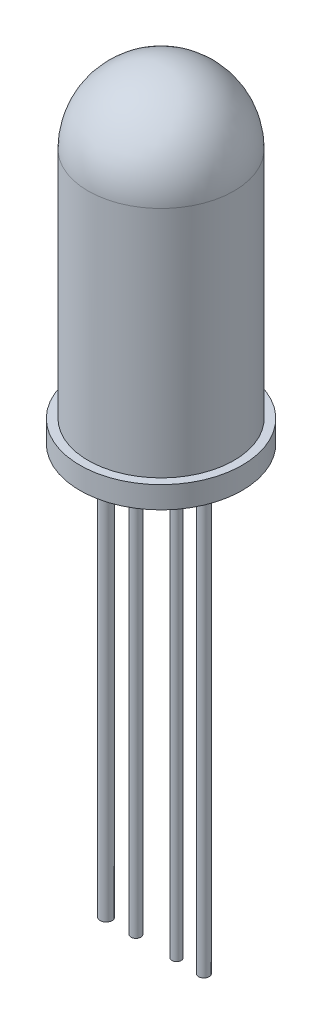
ISO-10303-21;
HEADER;
FILE_DESCRIPTION(('STEP AP214'),'2;1');
FILE_NAME('part.step','',(''),(''),'','','');
FILE_SCHEMA(('AUTOMOTIVE_DESIGN { 1 0 10303 214 1 1 1 1 }'));
ENDSEC;
DATA;
#1=APPLICATION_CONTEXT('core data for automotive mechanical design processes');
#2=APPLICATION_PROTOCOL_DEFINITION('international standard','automotive_design',2000,#1);
#3=PRODUCT_CONTEXT('',#1,'mechanical');
#4=PRODUCT('Part','Part','',(#3));
#5=PRODUCT_RELATED_PRODUCT_CATEGORY('part','',(#4));
#6=PRODUCT_DEFINITION_FORMATION('','',#4);
#7=PRODUCT_DEFINITION_CONTEXT('part definition',#1,'design');
#8=PRODUCT_DEFINITION('design','',#6,#7);
#9=PRODUCT_DEFINITION_SHAPE('','',#8);
#10=(LENGTH_UNIT() NAMED_UNIT(*) SI_UNIT(.MILLI.,.METRE.));
#11=(NAMED_UNIT(*) PLANE_ANGLE_UNIT() SI_UNIT($,.RADIAN.));
#12=(NAMED_UNIT(*) SI_UNIT($,.STERADIAN.) SOLID_ANGLE_UNIT());
#13=UNCERTAINTY_MEASURE_WITH_UNIT(LENGTH_MEASURE(1.E-05),#10,'distance_accuracy_value','');
#14=(GEOMETRIC_REPRESENTATION_CONTEXT(3) GLOBAL_UNCERTAINTY_ASSIGNED_CONTEXT((#13)) GLOBAL_UNIT_ASSIGNED_CONTEXT((#10,
#11,#12)) REPRESENTATION_CONTEXT('',''));
#15=CARTESIAN_POINT('',(0.,0.,0.));
#16=DIRECTION('',(0.,0.,1.));
#17=DIRECTION('',(1.,0.,0.));
#18=AXIS2_PLACEMENT_3D('',#15,#16,#17);
#19=CARTESIAN_POINT('',(1.17503083359897,-12.,0.));
#20=DIRECTION('',(0.,1.,0.));
#21=DIRECTION('',(0.,0.,1.));
#22=AXIS2_PLACEMENT_3D('',#19,#20,#21);
#23=CYLINDRICAL_SURFACE('',#22,0.147647853436519);
#24=CARTESIAN_POINT('',(1.17503083359897,-12.,0.));
#25=DIRECTION('',(0.,-1.,0.));
#26=DIRECTION('',(0.,0.,-1.));
#27=AXIS2_PLACEMENT_3D('',#24,#25,#26);
#28=CIRCLE('',#27,0.147647853436519);
#29=CARTESIAN_POINT('',(1.17503083359897,-12.,-0.147647853436519));
#30=VERTEX_POINT('',#29);
#31=EDGE_CURVE('E11',#30,#30,#28,.T.);
#32=ORIENTED_EDGE('',*,*,#31,.F.);
#33=EDGE_LOOP('',(#32));
#34=FACE_BOUND('',#33,.T.);
#35=CARTESIAN_POINT('',(1.17503083359897,0.,0.));
#36=DIRECTION('',(0.,-1.,0.));
#37=DIRECTION('',(0.,0.,-1.));
#38=AXIS2_PLACEMENT_3D('',#35,#36,#37);
#39=CIRCLE('',#38,0.147647853436519);
#40=CARTESIAN_POINT('',(1.17503083359897,0.,-0.147647853436519));
#41=VERTEX_POINT('',#40);
#42=EDGE_CURVE('E44',#41,#41,#39,.T.);
#43=ORIENTED_EDGE('',*,*,#42,.T.);
#44=EDGE_LOOP('',(#43));
#45=FACE_BOUND('',#44,.T.);
#46=ADVANCED_FACE('F41',(#34,#45),#23,.T.);
#47=CARTESIAN_POINT('',(1.17503083359897,-12.,0.));
#48=DIRECTION('',(0.,-1.,0.));
#49=DIRECTION('',(0.,0.,-1.));
#50=AXIS2_PLACEMENT_3D('',#47,#48,#49);
#51=PLANE('',#50);
#52=ORIENTED_EDGE('',*,*,#31,.T.);
#53=EDGE_LOOP('',(#52));
#54=FACE_BOUND('',#53,.T.);
#55=ADVANCED_FACE('F56',(#54),#51,.T.);
#56=CARTESIAN_POINT('',(1.17503083359897,0.,0.));
#57=DIRECTION('',(0.,-1.,0.));
#58=DIRECTION('',(0.,0.,-1.));
#59=AXIS2_PLACEMENT_3D('',#56,#57,#58);
#60=PLANE('',#59);
#61=ORIENTED_EDGE('',*,*,#42,.F.);
#62=EDGE_LOOP('',(#61));
#63=FACE_BOUND('',#62,.T.);
#64=ADVANCED_FACE('F54',(#63),#60,.F.);
#65=CLOSED_SHELL('',(#46,#55,#64));
#66=MANIFOLD_SOLID_BREP('B2',#65);
#67=CARTESIAN_POINT('',(0.424487578629994,-12.,0.));
#68=DIRECTION('',(0.,1.,0.));
#69=DIRECTION('',(0.,0.,1.));
#70=AXIS2_PLACEMENT_3D('',#67,#68,#69);
#71=CYLINDRICAL_SURFACE('',#70,0.129191871756955);
#72=CARTESIAN_POINT('',(0.424487578629994,-12.,0.));
#73=DIRECTION('',(0.,-1.,0.));
#74=DIRECTION('',(0.,0.,-1.));
#75=AXIS2_PLACEMENT_3D('',#72,#73,#74);
#76=CIRCLE('',#75,0.129191871756955);
#77=CARTESIAN_POINT('',(0.424487578629994,-12.,-0.129191871756955));
#78=VERTEX_POINT('',#77);
#79=EDGE_CURVE('E40',#78,#78,#76,.T.);
#80=ORIENTED_EDGE('',*,*,#79,.F.);
#81=EDGE_LOOP('',(#80));
#82=FACE_BOUND('',#81,.T.);
#83=CARTESIAN_POINT('',(0.424487578629994,0.,0.));
#84=DIRECTION('',(0.,-1.,0.));
#85=DIRECTION('',(0.,0.,-1.));
#86=AXIS2_PLACEMENT_3D('',#83,#84,#85);
#87=CIRCLE('',#86,0.129191871756955);
#88=CARTESIAN_POINT('',(0.424487578629994,0.,-0.129191871756955));
#89=VERTEX_POINT('',#88);
#90=EDGE_CURVE('E92',#89,#89,#87,.T.);
#91=ORIENTED_EDGE('',*,*,#90,.T.);
#92=EDGE_LOOP('',(#91));
#93=FACE_BOUND('',#92,.T.);
#94=ADVANCED_FACE('F89',(#82,#93),#71,.T.);
#95=CARTESIAN_POINT('',(0.424487578629994,-12.,0.));
#96=DIRECTION('',(0.,-1.,0.));
#97=DIRECTION('',(0.,0.,-1.));
#98=AXIS2_PLACEMENT_3D('',#95,#96,#97);
#99=PLANE('',#98);
#100=ORIENTED_EDGE('',*,*,#79,.T.);
#101=EDGE_LOOP('',(#100));
#102=FACE_BOUND('',#101,.T.);
#103=ADVANCED_FACE('F104',(#102),#99,.T.);
#104=CARTESIAN_POINT('',(0.424487578629994,0.,0.));
#105=DIRECTION('',(0.,-1.,0.));
#106=DIRECTION('',(0.,0.,-1.));
#107=AXIS2_PLACEMENT_3D('',#104,#105,#106);
#108=PLANE('',#107);
#109=ORIENTED_EDGE('',*,*,#90,.F.);
#110=EDGE_LOOP('',(#109));
#111=FACE_BOUND('',#110,.T.);
#112=ADVANCED_FACE('F102',(#111),#108,.F.);
#113=CLOSED_SHELL('',(#94,#103,#112));
#114=MANIFOLD_SOLID_BREP('B6',#113);
#115=CARTESIAN_POINT('',(-1.50723850383114,-12.,0.));
#116=DIRECTION('',(0.,1.,0.));
#117=DIRECTION('',(0.,0.,1.));
#118=AXIS2_PLACEMENT_3D('',#115,#116,#117);
#119=CYLINDRICAL_SURFACE('',#118,0.166103835116085);
#120=CARTESIAN_POINT('',(-1.50723850383114,-12.,0.));
#121=DIRECTION('',(0.,-1.,0.));
#122=DIRECTION('',(0.,0.,-1.));
#123=AXIS2_PLACEMENT_3D('',#120,#121,#122);
#124=CIRCLE('',#123,0.166103835116085);
#125=CARTESIAN_POINT('',(-1.50723850383114,-12.,-0.166103835116085));
#126=VERTEX_POINT('',#125);
#127=EDGE_CURVE('E88',#126,#126,#124,.T.);
#128=ORIENTED_EDGE('',*,*,#127,.F.);
#129=EDGE_LOOP('',(#128));
#130=FACE_BOUND('',#129,.T.);
#131=CARTESIAN_POINT('',(-1.50723850383114,0.,0.));
#132=DIRECTION('',(0.,-1.,0.));
#133=DIRECTION('',(0.,0.,-1.));
#134=AXIS2_PLACEMENT_3D('',#131,#132,#133);
#135=CIRCLE('',#134,0.166103835116085);
#136=CARTESIAN_POINT('',(-1.50723850383114,0.,-0.166103835116085));
#137=VERTEX_POINT('',#136);
#138=EDGE_CURVE('E140',#137,#137,#135,.T.);
#139=ORIENTED_EDGE('',*,*,#138,.T.);
#140=EDGE_LOOP('',(#139));
#141=FACE_BOUND('',#140,.T.);
#142=ADVANCED_FACE('F137',(#130,#141),#119,.T.);
#143=CARTESIAN_POINT('',(-1.50723850383114,-12.,0.));
#144=DIRECTION('',(0.,-1.,0.));
#145=DIRECTION('',(0.,0.,-1.));
#146=AXIS2_PLACEMENT_3D('',#143,#144,#145);
#147=PLANE('',#146);
#148=ORIENTED_EDGE('',*,*,#127,.T.);
#149=EDGE_LOOP('',(#148));
#150=FACE_BOUND('',#149,.T.);
#151=ADVANCED_FACE('F152',(#150),#147,.T.);
#152=CARTESIAN_POINT('',(-1.50723850383114,0.,0.));
#153=DIRECTION('',(0.,-1.,0.));
#154=DIRECTION('',(0.,0.,-1.));
#155=AXIS2_PLACEMENT_3D('',#152,#153,#154);
#156=PLANE('',#155);
#157=ORIENTED_EDGE('',*,*,#138,.F.);
#158=EDGE_LOOP('',(#157));
#159=FACE_BOUND('',#158,.T.);
#160=ADVANCED_FACE('F150',(#159),#156,.F.);
#161=CLOSED_SHELL('',(#142,#151,#160));
#162=MANIFOLD_SOLID_BREP('B35',#161);
#163=CARTESIAN_POINT('',(-0.689023316037091,-12.,0.));
#164=DIRECTION('',(0.,1.,0.));
#165=DIRECTION('',(0.,0.,1.));
#166=AXIS2_PLACEMENT_3D('',#163,#164,#165);
#167=CYLINDRICAL_SURFACE('',#166,0.135343865650143);
#168=CARTESIAN_POINT('',(-0.689023316037091,-12.,0.));
#169=DIRECTION('',(0.,-1.,0.));
#170=DIRECTION('',(0.,0.,-1.));
#171=AXIS2_PLACEMENT_3D('',#168,#169,#170);
#172=CIRCLE('',#171,0.135343865650143);
#173=CARTESIAN_POINT('',(-0.689023316037091,-12.,-0.135343865650143));
#174=VERTEX_POINT('',#173);
#175=EDGE_CURVE('E136',#174,#174,#172,.T.);
#176=ORIENTED_EDGE('',*,*,#175,.F.);
#177=EDGE_LOOP('',(#176));
#178=FACE_BOUND('',#177,.T.);
#179=CARTESIAN_POINT('',(-0.689023316037091,0.,0.));
#180=DIRECTION('',(0.,-1.,0.));
#181=DIRECTION('',(0.,0.,-1.));
#182=AXIS2_PLACEMENT_3D('',#179,#180,#181);
#183=CIRCLE('',#182,0.135343865650143);
#184=CARTESIAN_POINT('',(-0.689023316037091,0.,-0.135343865650143));
#185=VERTEX_POINT('',#184);
#186=EDGE_CURVE('E187',#185,#185,#183,.T.);
#187=ORIENTED_EDGE('',*,*,#186,.T.);
#188=EDGE_LOOP('',(#187));
#189=FACE_BOUND('',#188,.T.);
#190=ADVANCED_FACE('F184',(#178,#189),#167,.T.);
#191=CARTESIAN_POINT('',(-0.689023316037091,-12.,0.));
#192=DIRECTION('',(0.,-1.,0.));
#193=DIRECTION('',(0.,0.,-1.));
#194=AXIS2_PLACEMENT_3D('',#191,#192,#193);
#195=PLANE('',#194);
#196=ORIENTED_EDGE('',*,*,#175,.T.);
#197=EDGE_LOOP('',(#196));
#198=FACE_BOUND('',#197,.T.);
#199=ADVANCED_FACE('F199',(#198),#195,.T.);
#200=CARTESIAN_POINT('',(-0.689023316037091,0.,0.));
#201=DIRECTION('',(0.,-1.,0.));
#202=DIRECTION('',(0.,0.,-1.));
#203=AXIS2_PLACEMENT_3D('',#200,#201,#202);
#204=PLANE('',#203);
#205=ORIENTED_EDGE('',*,*,#186,.F.);
#206=EDGE_LOOP('',(#205));
#207=FACE_BOUND('',#206,.T.);
#208=ADVANCED_FACE('F197',(#207),#204,.F.);
#209=CLOSED_SHELL('',(#190,#199,#208));
#210=MANIFOLD_SOLID_BREP('B83',#209);
#211=CARTESIAN_POINT('',(0.,9.,0.));
#212=DIRECTION('',(0.,-1.,0.));
#213=DIRECTION('',(0.,0.,-1.));
#214=AXIS2_PLACEMENT_3D('',#211,#212,#213);
#215=CYLINDRICAL_SURFACE('',#214,2.);
#216=CARTESIAN_POINT('',(0.,7.,0.));
#217=DIRECTION('',(0.,-1.,0.));
#218=DIRECTION('',(0.,0.,-1.));
#219=AXIS2_PLACEMENT_3D('',#216,#217,#218);
#220=CIRCLE('',#219,2.);
#221=CARTESIAN_POINT('',(0.,7.,-2.));
#222=VERTEX_POINT('',#221);
#223=EDGE_CURVE('E231',#222,#222,#220,.T.);
#224=ORIENTED_EDGE('',*,*,#223,.T.);
#225=EDGE_LOOP('',(#224));
#226=FACE_BOUND('',#225,.T.);
#227=CARTESIAN_POINT('',(0.,0.6,0.));
#228=DIRECTION('',(0.,-1.,0.));
#229=DIRECTION('',(0.,0.,-1.));
#230=AXIS2_PLACEMENT_3D('',#227,#228,#229);
#231=CIRCLE('',#230,2.);
#232=CARTESIAN_POINT('',(0.,0.6,-2.));
#233=VERTEX_POINT('',#232);
#234=EDGE_CURVE('E183',#233,#233,#231,.T.);
#235=ORIENTED_EDGE('',*,*,#234,.F.);
#236=EDGE_LOOP('',(#235));
#237=FACE_BOUND('',#236,.T.);
#238=ADVANCED_FACE('F224',(#226,#237),#215,.T.);
#239=CARTESIAN_POINT('',(0.,7.,0.));
#240=DIRECTION('',(0.,1.,0.));
#241=DIRECTION('',(0.,0.,1.));
#242=AXIS2_PLACEMENT_3D('',#239,#240,#241);
#243=SPHERICAL_SURFACE('',#242,2.);
#244=ORIENTED_EDGE('',*,*,#223,.F.);
#245=EDGE_LOOP('',(#244));
#246=FACE_BOUND('',#245,.T.);
#247=ADVANCED_FACE('F226',(#246),#243,.T.);
#248=CARTESIAN_POINT('',(0.,0.6,0.));
#249=DIRECTION('',(0.,-1.,0.));
#250=DIRECTION('',(0.,0.,-1.));
#251=AXIS2_PLACEMENT_3D('',#248,#249,#250);
#252=CYLINDRICAL_SURFACE('',#251,2.22598604348731);
#253=CARTESIAN_POINT('',(0.,0.6,0.));
#254=DIRECTION('',(0.,-1.,0.));
#255=DIRECTION('',(0.,0.,-1.));
#256=AXIS2_PLACEMENT_3D('',#253,#254,#255);
#257=CIRCLE('',#256,2.22598604348731);
#258=CARTESIAN_POINT('',(0.,0.6,-2.22598604348731));
#259=VERTEX_POINT('',#258);
#260=EDGE_CURVE('E235',#259,#259,#257,.T.);
#261=ORIENTED_EDGE('',*,*,#260,.T.);
#262=EDGE_LOOP('',(#261));
#263=FACE_BOUND('',#262,.T.);
#264=CARTESIAN_POINT('',(0.,0.,0.));
#265=DIRECTION('',(0.,-1.,0.));
#266=DIRECTION('',(0.,0.,-1.));
#267=AXIS2_PLACEMENT_3D('',#264,#265,#266);
#268=CIRCLE('',#267,2.22598604348731);
#269=CARTESIAN_POINT('',(0.,0.,-2.22598604348731));
#270=VERTEX_POINT('',#269);
#271=EDGE_CURVE('E239',#270,#270,#268,.T.);
#272=ORIENTED_EDGE('',*,*,#271,.F.);
#273=EDGE_LOOP('',(#272));
#274=FACE_BOUND('',#273,.T.);
#275=ADVANCED_FACE('F247',(#263,#274),#252,.T.);
#276=CARTESIAN_POINT('',(0.,0.6,0.));
#277=DIRECTION('',(0.,-1.,0.));
#278=DIRECTION('',(0.,0.,-1.));
#279=AXIS2_PLACEMENT_3D('',#276,#277,#278);
#280=PLANE('',#279);
#281=ORIENTED_EDGE('',*,*,#234,.T.);
#282=EDGE_LOOP('',(#281));
#283=FACE_BOUND('',#282,.T.);
#284=ORIENTED_EDGE('',*,*,#260,.F.);
#285=EDGE_LOOP('',(#284));
#286=FACE_BOUND('',#285,.T.);
#287=ADVANCED_FACE('F249',(#283,#286),#280,.F.);
#288=CARTESIAN_POINT('',(0.,0.,0.));
#289=DIRECTION('',(0.,1.,0.));
#290=DIRECTION('',(0.,0.,1.));
#291=AXIS2_PLACEMENT_3D('',#288,#289,#290);
#292=PLANE('',#291);
#293=ORIENTED_EDGE('',*,*,#271,.T.);
#294=EDGE_LOOP('',(#293));
#295=FACE_BOUND('',#294,.T.);
#296=ADVANCED_FACE('F245',(#295),#292,.F.);
#297=CLOSED_SHELL('',(#238,#247,#275,#287,#296));
#298=MANIFOLD_SOLID_BREP('B131',#297);
#299=ADVANCED_BREP_SHAPE_REPRESENTATION('',(#18,#66,#114,#162,#210,#298),#14);
#300=SHAPE_DEFINITION_REPRESENTATION(#9,#299);
ENDSEC;
END-ISO-10303-21;
